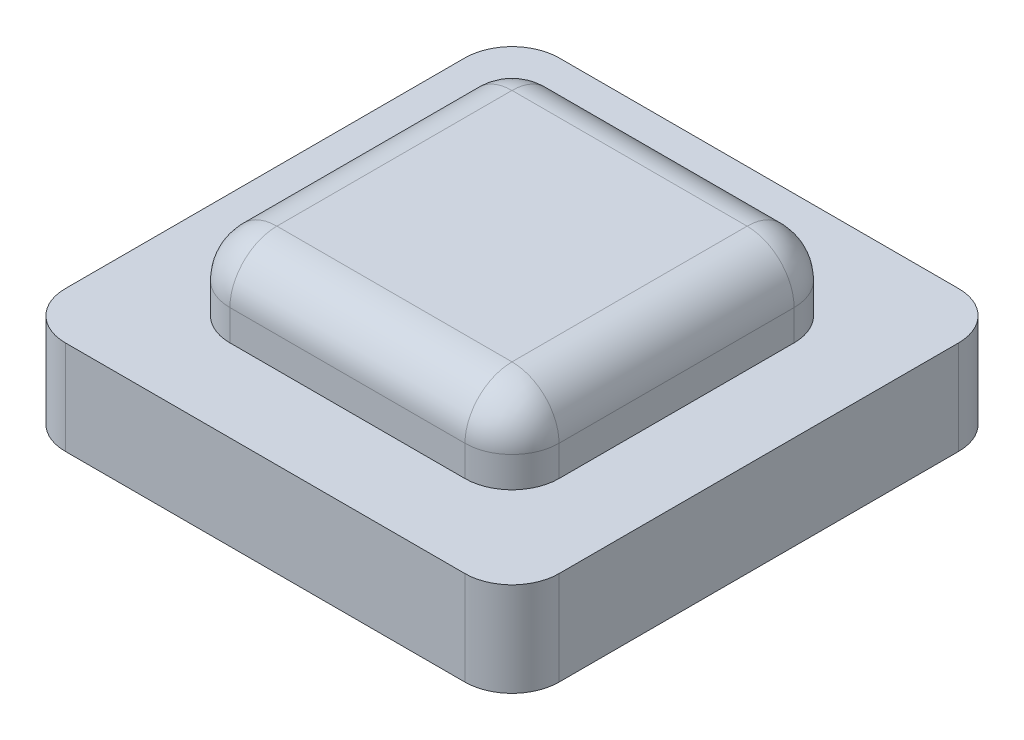
ISO-10303-21;
HEADER;
FILE_DESCRIPTION(('STEP AP214'),'2;1');
FILE_NAME('part.step','',(''),(''),'','','');
FILE_SCHEMA(('AUTOMOTIVE_DESIGN { 1 0 10303 214 1 1 1 1 }'));
ENDSEC;
DATA;
#1=APPLICATION_CONTEXT('core data for automotive mechanical design processes');
#2=APPLICATION_PROTOCOL_DEFINITION('international standard','automotive_design',2000,#1);
#3=PRODUCT_CONTEXT('',#1,'mechanical');
#4=PRODUCT('Part','Part','',(#3));
#5=PRODUCT_RELATED_PRODUCT_CATEGORY('part','',(#4));
#6=PRODUCT_DEFINITION_FORMATION('','',#4);
#7=PRODUCT_DEFINITION_CONTEXT('part definition',#1,'design');
#8=PRODUCT_DEFINITION('design','',#6,#7);
#9=PRODUCT_DEFINITION_SHAPE('','',#8);
#10=(LENGTH_UNIT() NAMED_UNIT(*) SI_UNIT(.MILLI.,.METRE.));
#11=(NAMED_UNIT(*) PLANE_ANGLE_UNIT() SI_UNIT($,.RADIAN.));
#12=(NAMED_UNIT(*) SI_UNIT($,.STERADIAN.) SOLID_ANGLE_UNIT());
#13=UNCERTAINTY_MEASURE_WITH_UNIT(LENGTH_MEASURE(1.E-05),#10,'distance_accuracy_value','');
#14=(GEOMETRIC_REPRESENTATION_CONTEXT(3) GLOBAL_UNCERTAINTY_ASSIGNED_CONTEXT((#13)) GLOBAL_UNIT_ASSIGNED_CONTEXT((#10,
#11,#12)) REPRESENTATION_CONTEXT('',''));
#15=CARTESIAN_POINT('',(0.,0.,0.));
#16=DIRECTION('',(0.,0.,1.));
#17=DIRECTION('',(1.,0.,0.));
#18=AXIS2_PLACEMENT_3D('',#15,#16,#17);
#19=CARTESIAN_POINT('',(0.,0.,0.));
#20=DIRECTION('',(0.,1.,0.));
#21=DIRECTION('',(0.,0.,1.));
#22=AXIS2_PLACEMENT_3D('',#19,#20,#21);
#23=PLANE('',#22);
#24=DIRECTION('',(0.,0.,1.));
#25=VECTOR('',#24,1.);
#26=CARTESIAN_POINT('',(-10.5,0.,-10.5));
#27=LINE('',#26,#25);
#28=CARTESIAN_POINT('',(-10.5,0.,-8.5));
#29=VERTEX_POINT('',#28);
#30=CARTESIAN_POINT('',(-10.5,0.,8.49999999999999));
#31=VERTEX_POINT('',#30);
#32=EDGE_CURVE('E240',#29,#31,#27,.T.);
#33=ORIENTED_EDGE('',*,*,#32,.F.);
#34=CARTESIAN_POINT('',(-8.5,0.,-8.5));
#35=DIRECTION('',(0.,1.,0.));
#36=DIRECTION('',(0.,0.,1.));
#37=AXIS2_PLACEMENT_3D('',#34,#35,#36);
#38=CIRCLE('',#37,2.);
#39=CARTESIAN_POINT('',(-8.5,0.,-10.5));
#40=VERTEX_POINT('',#39);
#41=EDGE_CURVE('E223',#29,#40,#38,.F.);
#42=ORIENTED_EDGE('',*,*,#41,.T.);
#43=DIRECTION('',(-1.,0.,0.));
#44=VECTOR('',#43,1.);
#45=CARTESIAN_POINT('',(-10.5,0.,-10.5));
#46=LINE('',#45,#44);
#47=CARTESIAN_POINT('',(8.49999999999999,0.,-10.5));
#48=VERTEX_POINT('',#47);
#49=EDGE_CURVE('E250',#48,#40,#46,.T.);
#50=ORIENTED_EDGE('',*,*,#49,.F.);
#51=CARTESIAN_POINT('',(8.5,0.,-8.5));
#52=DIRECTION('',(0.,1.,0.));
#53=DIRECTION('',(0.,0.,1.));
#54=AXIS2_PLACEMENT_3D('',#51,#52,#53);
#55=CIRCLE('',#54,2.);
#56=CARTESIAN_POINT('',(10.5,0.,-8.5));
#57=VERTEX_POINT('',#56);
#58=EDGE_CURVE('E234',#48,#57,#55,.F.);
#59=ORIENTED_EDGE('',*,*,#58,.T.);
#60=DIRECTION('',(0.,0.,-1.));
#61=VECTOR('',#60,1.);
#62=CARTESIAN_POINT('',(10.5,0.,-10.5));
#63=LINE('',#62,#61);
#64=CARTESIAN_POINT('',(10.5,0.,8.49999999999999));
#65=VERTEX_POINT('',#64);
#66=EDGE_CURVE('E255',#65,#57,#63,.T.);
#67=ORIENTED_EDGE('',*,*,#66,.F.);
#68=CARTESIAN_POINT('',(8.5,0.,8.5));
#69=DIRECTION('',(0.,1.,0.));
#70=DIRECTION('',(0.,0.,1.));
#71=AXIS2_PLACEMENT_3D('',#68,#69,#70);
#72=CIRCLE('',#71,2.);
#73=CARTESIAN_POINT('',(8.49999999999999,0.,10.5));
#74=VERTEX_POINT('',#73);
#75=EDGE_CURVE('E262',#65,#74,#72,.F.);
#76=ORIENTED_EDGE('',*,*,#75,.T.);
#77=DIRECTION('',(1.,0.,0.));
#78=VECTOR('',#77,1.);
#79=CARTESIAN_POINT('',(-10.5,0.,10.5));
#80=LINE('',#79,#78);
#81=CARTESIAN_POINT('',(-8.5,0.,10.5));
#82=VERTEX_POINT('',#81);
#83=EDGE_CURVE('E249',#82,#74,#80,.T.);
#84=ORIENTED_EDGE('',*,*,#83,.F.);
#85=CARTESIAN_POINT('',(-8.5,0.,8.5));
#86=DIRECTION('',(0.,1.,0.));
#87=DIRECTION('',(0.,0.,1.));
#88=AXIS2_PLACEMENT_3D('',#85,#86,#87);
#89=CIRCLE('',#88,2.);
#90=EDGE_CURVE('E244',#82,#31,#89,.F.);
#91=ORIENTED_EDGE('',*,*,#90,.T.);
#92=EDGE_LOOP('',(#33,#42,#50,#59,#67,#76,#84,#91));
#93=FACE_BOUND('',#92,.T.);
#94=DIRECTION('',(0.,0.,1.));
#95=VECTOR('',#94,1.);
#96=CARTESIAN_POINT('',(4.75,0.,4.75));
#97=LINE('',#96,#95);
#98=CARTESIAN_POINT('',(4.75,0.,-2.75));
#99=VERTEX_POINT('',#98);
#100=CARTESIAN_POINT('',(4.75,0.,2.75));
#101=VERTEX_POINT('',#100);
#102=EDGE_CURVE('E453',#99,#101,#97,.T.);
#103=ORIENTED_EDGE('',*,*,#102,.F.);
#104=CARTESIAN_POINT('',(2.75,0.,-2.75));
#105=DIRECTION('',(0.,1.,0.));
#106=DIRECTION('',(0.,0.,1.));
#107=AXIS2_PLACEMENT_3D('',#104,#105,#106);
#108=CIRCLE('',#107,2.);
#109=CARTESIAN_POINT('',(2.75,0.,-4.75));
#110=VERTEX_POINT('',#109);
#111=EDGE_CURVE('E11',#99,#110,#108,.T.);
#112=ORIENTED_EDGE('',*,*,#111,.T.);
#113=DIRECTION('',(1.,0.,0.));
#114=VECTOR('',#113,1.);
#115=CARTESIAN_POINT('',(-4.75,0.,-4.75));
#116=LINE('',#115,#114);
#117=CARTESIAN_POINT('',(-2.75,0.,-4.75));
#118=VERTEX_POINT('',#117);
#119=EDGE_CURVE('E456',#118,#110,#116,.T.);
#120=ORIENTED_EDGE('',*,*,#119,.F.);
#121=CARTESIAN_POINT('',(-2.75,0.,-2.75));
#122=DIRECTION('',(0.,1.,0.));
#123=DIRECTION('',(0.,0.,1.));
#124=AXIS2_PLACEMENT_3D('',#121,#122,#123);
#125=CIRCLE('',#124,2.);
#126=CARTESIAN_POINT('',(-4.75,0.,-2.75));
#127=VERTEX_POINT('',#126);
#128=EDGE_CURVE('E394',#118,#127,#125,.T.);
#129=ORIENTED_EDGE('',*,*,#128,.T.);
#130=DIRECTION('',(0.,0.,-1.));
#131=VECTOR('',#130,1.);
#132=CARTESIAN_POINT('',(-4.75,0.,4.75));
#133=LINE('',#132,#131);
#134=CARTESIAN_POINT('',(-4.75,0.,2.75));
#135=VERTEX_POINT('',#134);
#136=EDGE_CURVE('E452',#135,#127,#133,.T.);
#137=ORIENTED_EDGE('',*,*,#136,.F.);
#138=CARTESIAN_POINT('',(-2.75,0.,2.75));
#139=DIRECTION('',(0.,1.,0.));
#140=DIRECTION('',(0.,0.,1.));
#141=AXIS2_PLACEMENT_3D('',#138,#139,#140);
#142=CIRCLE('',#141,2.);
#143=CARTESIAN_POINT('',(-2.75,0.,4.75));
#144=VERTEX_POINT('',#143);
#145=EDGE_CURVE('E396',#135,#144,#142,.T.);
#146=ORIENTED_EDGE('',*,*,#145,.T.);
#147=DIRECTION('',(-1.,0.,0.));
#148=VECTOR('',#147,1.);
#149=CARTESIAN_POINT('',(-4.75,0.,4.75));
#150=LINE('',#149,#148);
#151=CARTESIAN_POINT('',(2.75,0.,4.75));
#152=VERTEX_POINT('',#151);
#153=EDGE_CURVE('E446',#152,#144,#150,.T.);
#154=ORIENTED_EDGE('',*,*,#153,.F.);
#155=CARTESIAN_POINT('',(2.75,0.,2.75));
#156=DIRECTION('',(0.,1.,0.));
#157=DIRECTION('',(0.,0.,1.));
#158=AXIS2_PLACEMENT_3D('',#155,#156,#157);
#159=CIRCLE('',#158,2.);
#160=EDGE_CURVE('E46',#152,#101,#159,.T.);
#161=ORIENTED_EDGE('',*,*,#160,.T.);
#162=EDGE_LOOP('',(#103,#112,#120,#129,#137,#146,#154,#161));
#163=FACE_BOUND('',#162,.T.);
#164=ADVANCED_FACE('F37',(#93,#163),#23,.F.);
#165=CARTESIAN_POINT('',(10.5,4.,-10.5));
#166=DIRECTION('',(-1.,0.,0.));
#167=DIRECTION('',(0.,0.,1.));
#168=AXIS2_PLACEMENT_3D('',#165,#166,#167);
#169=PLANE('',#168);
#170=ORIENTED_EDGE('',*,*,#66,.T.);
#171=DIRECTION('',(0.,-1.,0.));
#172=VECTOR('',#171,1.);
#173=CARTESIAN_POINT('',(10.5,4.,-8.5));
#174=LINE('',#173,#172);
#175=CARTESIAN_POINT('',(10.5,4.,-8.5));
#176=VERTEX_POINT('',#175);
#177=EDGE_CURVE('E279',#57,#176,#174,.F.);
#178=ORIENTED_EDGE('',*,*,#177,.T.);
#179=DIRECTION('',(0.,0.,-1.));
#180=VECTOR('',#179,1.);
#181=CARTESIAN_POINT('',(10.5,4.,-10.5));
#182=LINE('',#181,#180);
#183=CARTESIAN_POINT('',(10.5,4.,8.49999999999999));
#184=VERTEX_POINT('',#183);
#185=EDGE_CURVE('E253',#184,#176,#182,.T.);
#186=ORIENTED_EDGE('',*,*,#185,.F.);
#187=DIRECTION('',(0.,-1.,0.));
#188=VECTOR('',#187,1.);
#189=CARTESIAN_POINT('',(10.5,4.,8.5));
#190=LINE('',#189,#188);
#191=EDGE_CURVE('E276',#184,#65,#190,.T.);
#192=ORIENTED_EDGE('',*,*,#191,.T.);
#193=EDGE_LOOP('',(#170,#178,#186,#192));
#194=FACE_BOUND('',#193,.T.);
#195=ADVANCED_FACE('F475',(#194),#169,.F.);
#196=CARTESIAN_POINT('',(-10.5,4.,-10.5));
#197=DIRECTION('',(0.,0.,1.));
#198=DIRECTION('',(1.,0.,0.));
#199=AXIS2_PLACEMENT_3D('',#196,#197,#198);
#200=PLANE('',#199);
#201=ORIENTED_EDGE('',*,*,#49,.T.);
#202=DIRECTION('',(0.,-1.,0.));
#203=VECTOR('',#202,1.);
#204=CARTESIAN_POINT('',(-8.5,4.,-10.5));
#205=LINE('',#204,#203);
#206=CARTESIAN_POINT('',(-8.5,4.,-10.5));
#207=VERTEX_POINT('',#206);
#208=EDGE_CURVE('E228',#40,#207,#205,.F.);
#209=ORIENTED_EDGE('',*,*,#208,.T.);
#210=DIRECTION('',(-1.,0.,0.));
#211=VECTOR('',#210,1.);
#212=CARTESIAN_POINT('',(-10.5,4.,-10.5));
#213=LINE('',#212,#211);
#214=CARTESIAN_POINT('',(8.49999999999999,4.,-10.5));
#215=VERTEX_POINT('',#214);
#216=EDGE_CURVE('E466',#215,#207,#213,.T.);
#217=ORIENTED_EDGE('',*,*,#216,.F.);
#218=DIRECTION('',(0.,-1.,0.));
#219=VECTOR('',#218,1.);
#220=CARTESIAN_POINT('',(8.5,4.,-10.5));
#221=LINE('',#220,#219);
#222=EDGE_CURVE('E233',#215,#48,#221,.T.);
#223=ORIENTED_EDGE('',*,*,#222,.T.);
#224=EDGE_LOOP('',(#201,#209,#217,#223));
#225=FACE_BOUND('',#224,.T.);
#226=ADVANCED_FACE('F486',(#225),#200,.F.);
#227=CARTESIAN_POINT('',(-10.5,4.,-10.5));
#228=DIRECTION('',(1.,0.,0.));
#229=DIRECTION('',(0.,0.,-1.));
#230=AXIS2_PLACEMENT_3D('',#227,#228,#229);
#231=PLANE('',#230);
#232=DIRECTION('',(0.,0.,1.));
#233=VECTOR('',#232,1.);
#234=CARTESIAN_POINT('',(-10.5,4.,-10.5));
#235=LINE('',#234,#233);
#236=CARTESIAN_POINT('',(-10.5,4.,-8.5));
#237=VERTEX_POINT('',#236);
#238=CARTESIAN_POINT('',(-10.5,4.,8.49999999999999));
#239=VERTEX_POINT('',#238);
#240=EDGE_CURVE('E243',#237,#239,#235,.T.);
#241=ORIENTED_EDGE('',*,*,#240,.F.);
#242=DIRECTION('',(0.,-1.,0.));
#243=VECTOR('',#242,1.);
#244=CARTESIAN_POINT('',(-10.5,4.,-8.5));
#245=LINE('',#244,#243);
#246=EDGE_CURVE('E227',#237,#29,#245,.T.);
#247=ORIENTED_EDGE('',*,*,#246,.T.);
#248=ORIENTED_EDGE('',*,*,#32,.T.);
#249=DIRECTION('',(0.,-1.,0.));
#250=VECTOR('',#249,1.);
#251=CARTESIAN_POINT('',(-10.5,4.,8.5));
#252=LINE('',#251,#250);
#253=EDGE_CURVE('E245',#31,#239,#252,.F.);
#254=ORIENTED_EDGE('',*,*,#253,.T.);
#255=EDGE_LOOP('',(#241,#247,#248,#254));
#256=FACE_BOUND('',#255,.T.);
#257=ADVANCED_FACE('F239',(#256),#231,.F.);
#258=CARTESIAN_POINT('',(-10.5,4.,10.5));
#259=DIRECTION('',(0.,0.,-1.));
#260=DIRECTION('',(-1.,0.,0.));
#261=AXIS2_PLACEMENT_3D('',#258,#259,#260);
#262=PLANE('',#261);
#263=ORIENTED_EDGE('',*,*,#83,.T.);
#264=DIRECTION('',(0.,-1.,0.));
#265=VECTOR('',#264,1.);
#266=CARTESIAN_POINT('',(8.5,4.,10.5));
#267=LINE('',#266,#265);
#268=CARTESIAN_POINT('',(8.49999999999999,4.,10.5));
#269=VERTEX_POINT('',#268);
#270=EDGE_CURVE('E284',#74,#269,#267,.F.);
#271=ORIENTED_EDGE('',*,*,#270,.T.);
#272=DIRECTION('',(1.,0.,0.));
#273=VECTOR('',#272,1.);
#274=CARTESIAN_POINT('',(-10.5,4.,10.5));
#275=LINE('',#274,#273);
#276=CARTESIAN_POINT('',(-8.5,4.,10.5));
#277=VERTEX_POINT('',#276);
#278=EDGE_CURVE('E259',#277,#269,#275,.T.);
#279=ORIENTED_EDGE('',*,*,#278,.F.);
#280=DIRECTION('',(0.,-1.,0.));
#281=VECTOR('',#280,1.);
#282=CARTESIAN_POINT('',(-8.5,4.,10.5));
#283=LINE('',#282,#281);
#284=EDGE_CURVE('E281',#277,#82,#283,.T.);
#285=ORIENTED_EDGE('',*,*,#284,.T.);
#286=EDGE_LOOP('',(#263,#271,#279,#285));
#287=FACE_BOUND('',#286,.T.);
#288=ADVANCED_FACE('F493',(#287),#262,.F.);
#289=CARTESIAN_POINT('',(0.,4.,0.));
#290=DIRECTION('',(0.,1.,0.));
#291=DIRECTION('',(0.,0.,1.));
#292=AXIS2_PLACEMENT_3D('',#289,#290,#291);
#293=PLANE('',#292);
#294=DIRECTION('',(0.,0.,-1.));
#295=VECTOR('',#294,1.);
#296=CARTESIAN_POINT('',(7.,4.,-7.));
#297=LINE('',#296,#295);
#298=CARTESIAN_POINT('',(7.,4.,5.));
#299=VERTEX_POINT('',#298);
#300=CARTESIAN_POINT('',(7.,4.,-5.));
#301=VERTEX_POINT('',#300);
#302=EDGE_CURVE('E363',#299,#301,#297,.T.);
#303=ORIENTED_EDGE('',*,*,#302,.F.);
#304=CARTESIAN_POINT('',(5.,4.,5.));
#305=DIRECTION('',(0.,1.,0.));
#306=DIRECTION('',(0.,0.,1.));
#307=AXIS2_PLACEMENT_3D('',#304,#305,#306);
#308=CIRCLE('',#307,2.);
#309=CARTESIAN_POINT('',(5.,4.,7.));
#310=VERTEX_POINT('',#309);
#311=EDGE_CURVE('E326',#299,#310,#308,.F.);
#312=ORIENTED_EDGE('',*,*,#311,.T.);
#313=DIRECTION('',(1.,0.,0.));
#314=VECTOR('',#313,1.);
#315=CARTESIAN_POINT('',(-7.,4.,7.));
#316=LINE('',#315,#314);
#317=CARTESIAN_POINT('',(-5.,4.,7.));
#318=VERTEX_POINT('',#317);
#319=EDGE_CURVE('E458',#318,#310,#316,.T.);
#320=ORIENTED_EDGE('',*,*,#319,.F.);
#321=CARTESIAN_POINT('',(-5.,4.,5.));
#322=DIRECTION('',(0.,1.,0.));
#323=DIRECTION('',(0.,0.,1.));
#324=AXIS2_PLACEMENT_3D('',#321,#322,#323);
#325=CIRCLE('',#324,2.);
#326=CARTESIAN_POINT('',(-7.,4.,5.));
#327=VERTEX_POINT('',#326);
#328=EDGE_CURVE('E320',#318,#327,#325,.F.);
#329=ORIENTED_EDGE('',*,*,#328,.T.);
#330=DIRECTION('',(0.,0.,1.));
#331=VECTOR('',#330,1.);
#332=CARTESIAN_POINT('',(-7.,4.,-7.));
#333=LINE('',#332,#331);
#334=CARTESIAN_POINT('',(-7.,4.,-5.));
#335=VERTEX_POINT('',#334);
#336=EDGE_CURVE('E1037',#335,#327,#333,.T.);
#337=ORIENTED_EDGE('',*,*,#336,.F.);
#338=CARTESIAN_POINT('',(-5.,4.,-5.));
#339=DIRECTION('',(0.,1.,0.));
#340=DIRECTION('',(0.,0.,1.));
#341=AXIS2_PLACEMENT_3D('',#338,#339,#340);
#342=CIRCLE('',#341,2.);
#343=CARTESIAN_POINT('',(-5.,4.,-7.));
#344=VERTEX_POINT('',#343);
#345=EDGE_CURVE('E322',#335,#344,#342,.F.);
#346=ORIENTED_EDGE('',*,*,#345,.T.);
#347=DIRECTION('',(-1.,0.,0.));
#348=VECTOR('',#347,1.);
#349=CARTESIAN_POINT('',(-7.,4.,-7.));
#350=LINE('',#349,#348);
#351=CARTESIAN_POINT('',(5.,4.,-7.));
#352=VERTEX_POINT('',#351);
#353=EDGE_CURVE('E1021',#352,#344,#350,.T.);
#354=ORIENTED_EDGE('',*,*,#353,.F.);
#355=CARTESIAN_POINT('',(5.,4.,-5.));
#356=DIRECTION('',(0.,1.,0.));
#357=DIRECTION('',(0.,0.,1.));
#358=AXIS2_PLACEMENT_3D('',#355,#356,#357);
#359=CIRCLE('',#358,2.);
#360=EDGE_CURVE('E324',#352,#301,#359,.F.);
#361=ORIENTED_EDGE('',*,*,#360,.T.);
#362=EDGE_LOOP('',(#303,#312,#320,#329,#337,#346,#354,#361));
#363=FACE_BOUND('',#362,.T.);
#364=ORIENTED_EDGE('',*,*,#216,.T.);
#365=CARTESIAN_POINT('',(-8.5,4.,-8.5));
#366=DIRECTION('',(0.,1.,0.));
#367=DIRECTION('',(0.,0.,1.));
#368=AXIS2_PLACEMENT_3D('',#365,#366,#367);
#369=CIRCLE('',#368,2.);
#370=EDGE_CURVE('E274',#207,#237,#369,.T.);
#371=ORIENTED_EDGE('',*,*,#370,.T.);
#372=ORIENTED_EDGE('',*,*,#240,.T.);
#373=CARTESIAN_POINT('',(-8.5,4.,8.5));
#374=DIRECTION('',(0.,1.,0.));
#375=DIRECTION('',(0.,0.,1.));
#376=AXIS2_PLACEMENT_3D('',#373,#374,#375);
#377=CIRCLE('',#376,2.);
#378=EDGE_CURVE('E268',#239,#277,#377,.T.);
#379=ORIENTED_EDGE('',*,*,#378,.T.);
#380=ORIENTED_EDGE('',*,*,#278,.T.);
#381=CARTESIAN_POINT('',(8.5,4.,8.5));
#382=DIRECTION('',(0.,1.,0.));
#383=DIRECTION('',(0.,0.,1.));
#384=AXIS2_PLACEMENT_3D('',#381,#382,#383);
#385=CIRCLE('',#384,2.);
#386=EDGE_CURVE('E270',#269,#184,#385,.T.);
#387=ORIENTED_EDGE('',*,*,#386,.T.);
#388=ORIENTED_EDGE('',*,*,#185,.T.);
#389=CARTESIAN_POINT('',(8.5,4.,-8.5));
#390=DIRECTION('',(0.,1.,0.));
#391=DIRECTION('',(0.,0.,1.));
#392=AXIS2_PLACEMENT_3D('',#389,#390,#391);
#393=CIRCLE('',#392,2.);
#394=EDGE_CURVE('E272',#176,#215,#393,.T.);
#395=ORIENTED_EDGE('',*,*,#394,.T.);
#396=EDGE_LOOP('',(#364,#371,#372,#379,#380,#387,#388,#395));
#397=FACE_BOUND('',#396,.T.);
#398=ADVANCED_FACE('F484',(#363,#397),#293,.T.);
#399=CARTESIAN_POINT('',(4.75,-3.7,4.75));
#400=DIRECTION('',(-1.,0.,0.));
#401=DIRECTION('',(0.,0.,1.));
#402=AXIS2_PLACEMENT_3D('',#399,#400,#401);
#403=PLANE('',#402);
#404=ORIENTED_EDGE('',*,*,#102,.T.);
#405=DIRECTION('',(0.,1.,0.));
#406=VECTOR('',#405,1.);
#407=CARTESIAN_POINT('',(4.75,-3.7,2.75));
#408=LINE('',#407,#406);
#409=CARTESIAN_POINT('',(4.75,-1.7,2.75));
#410=VERTEX_POINT('',#409);
#411=EDGE_CURVE('E386',#101,#410,#408,.F.);
#412=ORIENTED_EDGE('',*,*,#411,.T.);
#413=DIRECTION('',(0.,0.,1.));
#414=VECTOR('',#413,1.);
#415=CARTESIAN_POINT('',(4.75,-1.7,-4.75));
#416=LINE('',#415,#414);
#417=CARTESIAN_POINT('',(4.75,-1.7,-2.75));
#418=VERTEX_POINT('',#417);
#419=EDGE_CURVE('E382',#410,#418,#416,.F.);
#420=ORIENTED_EDGE('',*,*,#419,.T.);
#421=DIRECTION('',(0.,1.,0.));
#422=VECTOR('',#421,1.);
#423=CARTESIAN_POINT('',(4.75,-3.7,-2.75));
#424=LINE('',#423,#422);
#425=EDGE_CURVE('E384',#418,#99,#424,.T.);
#426=ORIENTED_EDGE('',*,*,#425,.T.);
#427=EDGE_LOOP('',(#404,#412,#420,#426));
#428=FACE_BOUND('',#427,.T.);
#429=ADVANCED_FACE('F508',(#428),#403,.F.);
#430=CARTESIAN_POINT('',(-4.75,-3.7,4.75));
#431=DIRECTION('',(0.,0.,-1.));
#432=DIRECTION('',(-1.,0.,0.));
#433=AXIS2_PLACEMENT_3D('',#430,#431,#432);
#434=PLANE('',#433);
#435=ORIENTED_EDGE('',*,*,#153,.T.);
#436=DIRECTION('',(0.,1.,0.));
#437=VECTOR('',#436,1.);
#438=CARTESIAN_POINT('',(-2.75,-3.7,4.75));
#439=LINE('',#438,#437);
#440=CARTESIAN_POINT('',(-2.75,-1.7,4.75));
#441=VERTEX_POINT('',#440);
#442=EDGE_CURVE('E380',#144,#441,#439,.F.);
#443=ORIENTED_EDGE('',*,*,#442,.T.);
#444=DIRECTION('',(-1.,0.,0.));
#445=VECTOR('',#444,1.);
#446=CARTESIAN_POINT('',(4.75,-1.7,4.75));
#447=LINE('',#446,#445);
#448=CARTESIAN_POINT('',(2.75,-1.7,4.75));
#449=VERTEX_POINT('',#448);
#450=EDGE_CURVE('E376',#441,#449,#447,.F.);
#451=ORIENTED_EDGE('',*,*,#450,.T.);
#452=DIRECTION('',(0.,1.,0.));
#453=VECTOR('',#452,1.);
#454=CARTESIAN_POINT('',(2.75,-3.7,4.75));
#455=LINE('',#454,#453);
#456=EDGE_CURVE('E378',#449,#152,#455,.T.);
#457=ORIENTED_EDGE('',*,*,#456,.T.);
#458=EDGE_LOOP('',(#435,#443,#451,#457));
#459=FACE_BOUND('',#458,.T.);
#460=ADVANCED_FACE('F445',(#459),#434,.F.);
#461=CARTESIAN_POINT('',(-4.75,-3.7,4.75));
#462=DIRECTION('',(1.,0.,0.));
#463=DIRECTION('',(0.,0.,-1.));
#464=AXIS2_PLACEMENT_3D('',#461,#462,#463);
#465=PLANE('',#464);
#466=ORIENTED_EDGE('',*,*,#136,.T.);
#467=DIRECTION('',(0.,1.,0.));
#468=VECTOR('',#467,1.);
#469=CARTESIAN_POINT('',(-4.75,-3.7,-2.75));
#470=LINE('',#469,#468);
#471=CARTESIAN_POINT('',(-4.75,-1.7,-2.75));
#472=VERTEX_POINT('',#471);
#473=EDGE_CURVE('E374',#127,#472,#470,.F.);
#474=ORIENTED_EDGE('',*,*,#473,.T.);
#475=DIRECTION('',(0.,0.,-1.));
#476=VECTOR('',#475,1.);
#477=CARTESIAN_POINT('',(-4.75,-1.7,4.75));
#478=LINE('',#477,#476);
#479=CARTESIAN_POINT('',(-4.75,-1.7,2.75));
#480=VERTEX_POINT('',#479);
#481=EDGE_CURVE('E370',#472,#480,#478,.F.);
#482=ORIENTED_EDGE('',*,*,#481,.T.);
#483=DIRECTION('',(0.,1.,0.));
#484=VECTOR('',#483,1.);
#485=CARTESIAN_POINT('',(-4.75,-3.7,2.75));
#486=LINE('',#485,#484);
#487=EDGE_CURVE('E372',#480,#135,#486,.T.);
#488=ORIENTED_EDGE('',*,*,#487,.T.);
#489=EDGE_LOOP('',(#466,#474,#482,#488));
#490=FACE_BOUND('',#489,.T.);
#491=ADVANCED_FACE('F815',(#490),#465,.F.);
#492=CARTESIAN_POINT('',(-4.75,-3.7,-4.75));
#493=DIRECTION('',(0.,0.,1.));
#494=DIRECTION('',(1.,0.,0.));
#495=AXIS2_PLACEMENT_3D('',#492,#493,#494);
#496=PLANE('',#495);
#497=DIRECTION('',(1.,0.,0.));
#498=VECTOR('',#497,1.);
#499=CARTESIAN_POINT('',(-4.75,-1.7,-4.75));
#500=LINE('',#499,#498);
#501=CARTESIAN_POINT('',(2.75,-1.7,-4.75));
#502=VERTEX_POINT('',#501);
#503=CARTESIAN_POINT('',(-2.75,-1.7,-4.75));
#504=VERTEX_POINT('',#503);
#505=EDGE_CURVE('E328',#502,#504,#500,.F.);
#506=ORIENTED_EDGE('',*,*,#505,.T.);
#507=DIRECTION('',(0.,1.,0.));
#508=VECTOR('',#507,1.);
#509=CARTESIAN_POINT('',(-2.75,-3.7,-4.75));
#510=LINE('',#509,#508);
#511=EDGE_CURVE('E367',#504,#118,#510,.T.);
#512=ORIENTED_EDGE('',*,*,#511,.T.);
#513=ORIENTED_EDGE('',*,*,#119,.T.);
#514=DIRECTION('',(0.,1.,0.));
#515=VECTOR('',#514,1.);
#516=CARTESIAN_POINT('',(2.75,-3.7,-4.75));
#517=LINE('',#516,#515);
#518=EDGE_CURVE('E365',#110,#502,#517,.F.);
#519=ORIENTED_EDGE('',*,*,#518,.T.);
#520=EDGE_LOOP('',(#506,#512,#513,#519));
#521=FACE_BOUND('',#520,.T.);
#522=ADVANCED_FACE('F824',(#521),#496,.F.);
#523=CARTESIAN_POINT('',(0.,-3.7,0.));
#524=DIRECTION('',(0.,-1.,0.));
#525=DIRECTION('',(0.,0.,-1.));
#526=AXIS2_PLACEMENT_3D('',#523,#524,#525);
#527=PLANE('',#526);
#528=DIRECTION('',(0.,0.,-1.));
#529=VECTOR('',#528,1.);
#530=CARTESIAN_POINT('',(-2.75,-3.7,-4.75));
#531=LINE('',#530,#529);
#532=CARTESIAN_POINT('',(-2.75,-3.7,2.75));
#533=VERTEX_POINT('',#532);
#534=CARTESIAN_POINT('',(-2.75,-3.7,-2.75));
#535=VERTEX_POINT('',#534);
#536=EDGE_CURVE('E54',#533,#535,#531,.T.);
#537=ORIENTED_EDGE('',*,*,#536,.T.);
#538=DIRECTION('',(1.,0.,0.));
#539=VECTOR('',#538,1.);
#540=CARTESIAN_POINT('',(4.75,-3.7,-2.75));
#541=LINE('',#540,#539);
#542=CARTESIAN_POINT('',(2.75,-3.7,-2.75));
#543=VERTEX_POINT('',#542);
#544=EDGE_CURVE('E392',#535,#543,#541,.T.);
#545=ORIENTED_EDGE('',*,*,#544,.T.);
#546=DIRECTION('',(0.,0.,1.));
#547=VECTOR('',#546,1.);
#548=CARTESIAN_POINT('',(2.75,-3.7,4.75));
#549=LINE('',#548,#547);
#550=CARTESIAN_POINT('',(2.75,-3.7,2.75));
#551=VERTEX_POINT('',#550);
#552=EDGE_CURVE('E388',#543,#551,#549,.T.);
#553=ORIENTED_EDGE('',*,*,#552,.T.);
#554=DIRECTION('',(-1.,0.,0.));
#555=VECTOR('',#554,1.);
#556=CARTESIAN_POINT('',(-4.75,-3.7,2.75));
#557=LINE('',#556,#555);
#558=EDGE_CURVE('E59',#551,#533,#557,.T.);
#559=ORIENTED_EDGE('',*,*,#558,.T.);
#560=EDGE_LOOP('',(#537,#545,#553,#559));
#561=FACE_BOUND('',#560,.T.);
#562=ADVANCED_FACE('F726',(#561),#527,.T.);
#563=CARTESIAN_POINT('',(7.,7.3,-7.));
#564=DIRECTION('',(-1.,0.,0.));
#565=DIRECTION('',(0.,0.,1.));
#566=AXIS2_PLACEMENT_3D('',#563,#564,#565);
#567=PLANE('',#566);
#568=ORIENTED_EDGE('',*,*,#302,.T.);
#569=DIRECTION('',(0.,-1.,0.));
#570=VECTOR('',#569,1.);
#571=CARTESIAN_POINT('',(7.,7.3,-5.));
#572=LINE('',#571,#570);
#573=CARTESIAN_POINT('',(7.,5.3,-5.));
#574=VERTEX_POINT('',#573);
#575=EDGE_CURVE('E306',#301,#574,#572,.F.);
#576=ORIENTED_EDGE('',*,*,#575,.T.);
#577=DIRECTION('',(0.,0.,-1.));
#578=VECTOR('',#577,1.);
#579=CARTESIAN_POINT('',(7.,5.3,7.));
#580=LINE('',#579,#578);
#581=CARTESIAN_POINT('',(7.,5.3,5.));
#582=VERTEX_POINT('',#581);
#583=EDGE_CURVE('E304',#574,#582,#580,.F.);
#584=ORIENTED_EDGE('',*,*,#583,.T.);
#585=DIRECTION('',(0.,-1.,0.));
#586=VECTOR('',#585,1.);
#587=CARTESIAN_POINT('',(7.,7.3,5.));
#588=LINE('',#587,#586);
#589=EDGE_CURVE('E302',#582,#299,#588,.T.);
#590=ORIENTED_EDGE('',*,*,#589,.T.);
#591=EDGE_LOOP('',(#568,#576,#584,#590));
#592=FACE_BOUND('',#591,.T.);
#593=ADVANCED_FACE('F715',(#592),#567,.F.);
#594=CARTESIAN_POINT('',(-7.,7.3,-7.));
#595=DIRECTION('',(0.,0.,1.));
#596=DIRECTION('',(1.,0.,0.));
#597=AXIS2_PLACEMENT_3D('',#594,#595,#596);
#598=PLANE('',#597);
#599=ORIENTED_EDGE('',*,*,#353,.T.);
#600=DIRECTION('',(0.,-1.,0.));
#601=VECTOR('',#600,1.);
#602=CARTESIAN_POINT('',(-5.,7.3,-7.));
#603=LINE('',#602,#601);
#604=CARTESIAN_POINT('',(-5.,5.3,-7.));
#605=VERTEX_POINT('',#604);
#606=EDGE_CURVE('E312',#344,#605,#603,.F.);
#607=ORIENTED_EDGE('',*,*,#606,.T.);
#608=DIRECTION('',(-1.,0.,0.));
#609=VECTOR('',#608,1.);
#610=CARTESIAN_POINT('',(7.,5.3,-7.));
#611=LINE('',#610,#609);
#612=CARTESIAN_POINT('',(5.,5.3,-7.));
#613=VERTEX_POINT('',#612);
#614=EDGE_CURVE('E310',#605,#613,#611,.F.);
#615=ORIENTED_EDGE('',*,*,#614,.T.);
#616=DIRECTION('',(0.,-1.,0.));
#617=VECTOR('',#616,1.);
#618=CARTESIAN_POINT('',(5.,7.3,-7.));
#619=LINE('',#618,#617);
#620=EDGE_CURVE('E308',#613,#352,#619,.T.);
#621=ORIENTED_EDGE('',*,*,#620,.T.);
#622=EDGE_LOOP('',(#599,#607,#615,#621));
#623=FACE_BOUND('',#622,.T.);
#624=ADVANCED_FACE('F704',(#623),#598,.F.);
#625=CARTESIAN_POINT('',(-7.,7.3,-7.));
#626=DIRECTION('',(1.,0.,0.));
#627=DIRECTION('',(0.,0.,-1.));
#628=AXIS2_PLACEMENT_3D('',#625,#626,#627);
#629=PLANE('',#628);
#630=ORIENTED_EDGE('',*,*,#336,.T.);
#631=DIRECTION('',(0.,-1.,0.));
#632=VECTOR('',#631,1.);
#633=CARTESIAN_POINT('',(-7.,7.3,5.));
#634=LINE('',#633,#632);
#635=CARTESIAN_POINT('',(-7.,5.3,5.));
#636=VERTEX_POINT('',#635);
#637=EDGE_CURVE('E318',#327,#636,#634,.F.);
#638=ORIENTED_EDGE('',*,*,#637,.T.);
#639=DIRECTION('',(0.,0.,1.));
#640=VECTOR('',#639,1.);
#641=CARTESIAN_POINT('',(-7.,5.3,-7.));
#642=LINE('',#641,#640);
#643=CARTESIAN_POINT('',(-7.,5.3,-5.));
#644=VERTEX_POINT('',#643);
#645=EDGE_CURVE('E316',#636,#644,#642,.F.);
#646=ORIENTED_EDGE('',*,*,#645,.T.);
#647=DIRECTION('',(0.,-1.,0.));
#648=VECTOR('',#647,1.);
#649=CARTESIAN_POINT('',(-7.,7.3,-5.));
#650=LINE('',#649,#648);
#651=EDGE_CURVE('E314',#644,#335,#650,.T.);
#652=ORIENTED_EDGE('',*,*,#651,.T.);
#653=EDGE_LOOP('',(#630,#638,#646,#652));
#654=FACE_BOUND('',#653,.T.);
#655=ADVANCED_FACE('F693',(#654),#629,.F.);
#656=CARTESIAN_POINT('',(-7.,7.3,7.));
#657=DIRECTION('',(0.,0.,-1.));
#658=DIRECTION('',(-1.,0.,0.));
#659=AXIS2_PLACEMENT_3D('',#656,#657,#658);
#660=PLANE('',#659);
#661=DIRECTION('',(1.,0.,0.));
#662=VECTOR('',#661,1.);
#663=CARTESIAN_POINT('',(-7.,5.3,7.));
#664=LINE('',#663,#662);
#665=CARTESIAN_POINT('',(5.,5.3,7.));
#666=VERTEX_POINT('',#665);
#667=CARTESIAN_POINT('',(-5.,5.3,7.));
#668=VERTEX_POINT('',#667);
#669=EDGE_CURVE('E297',#666,#668,#664,.F.);
#670=ORIENTED_EDGE('',*,*,#669,.T.);
#671=DIRECTION('',(0.,-1.,0.));
#672=VECTOR('',#671,1.);
#673=CARTESIAN_POINT('',(-5.,7.3,7.));
#674=LINE('',#673,#672);
#675=EDGE_CURVE('E300',#668,#318,#674,.T.);
#676=ORIENTED_EDGE('',*,*,#675,.T.);
#677=ORIENTED_EDGE('',*,*,#319,.T.);
#678=DIRECTION('',(0.,-1.,0.));
#679=VECTOR('',#678,1.);
#680=CARTESIAN_POINT('',(5.,7.3,7.));
#681=LINE('',#680,#679);
#682=EDGE_CURVE('E295',#310,#666,#681,.F.);
#683=ORIENTED_EDGE('',*,*,#682,.T.);
#684=EDGE_LOOP('',(#670,#676,#677,#683));
#685=FACE_BOUND('',#684,.T.);
#686=ADVANCED_FACE('F680',(#685),#660,.F.);
#687=CARTESIAN_POINT('',(0.,7.3,0.));
#688=DIRECTION('',(0.,1.,0.));
#689=DIRECTION('',(0.,0.,1.));
#690=AXIS2_PLACEMENT_3D('',#687,#688,#689);
#691=PLANE('',#690);
#692=DIRECTION('',(0.,0.,1.));
#693=VECTOR('',#692,1.);
#694=CARTESIAN_POINT('',(-5.,7.3,7.));
#695=LINE('',#694,#693);
#696=CARTESIAN_POINT('',(-5.,7.3,-5.));
#697=VERTEX_POINT('',#696);
#698=CARTESIAN_POINT('',(-5.,7.3,5.));
#699=VERTEX_POINT('',#698);
#700=EDGE_CURVE('E286',#697,#699,#695,.T.);
#701=ORIENTED_EDGE('',*,*,#700,.T.);
#702=DIRECTION('',(1.,0.,0.));
#703=VECTOR('',#702,1.);
#704=CARTESIAN_POINT('',(7.,7.3,5.));
#705=LINE('',#704,#703);
#706=CARTESIAN_POINT('',(5.,7.3,5.));
#707=VERTEX_POINT('',#706);
#708=EDGE_CURVE('E292',#699,#707,#705,.T.);
#709=ORIENTED_EDGE('',*,*,#708,.T.);
#710=DIRECTION('',(0.,0.,-1.));
#711=VECTOR('',#710,1.);
#712=CARTESIAN_POINT('',(5.,7.3,-7.));
#713=LINE('',#712,#711);
#714=CARTESIAN_POINT('',(5.,7.3,-5.));
#715=VERTEX_POINT('',#714);
#716=EDGE_CURVE('E290',#707,#715,#713,.T.);
#717=ORIENTED_EDGE('',*,*,#716,.T.);
#718=DIRECTION('',(-1.,0.,0.));
#719=VECTOR('',#718,1.);
#720=CARTESIAN_POINT('',(-7.,7.3,-5.));
#721=LINE('',#720,#719);
#722=EDGE_CURVE('E288',#715,#697,#721,.T.);
#723=ORIENTED_EDGE('',*,*,#722,.T.);
#724=EDGE_LOOP('',(#701,#709,#717,#723));
#725=FACE_BOUND('',#724,.T.);
#726=ADVANCED_FACE('F675',(#725),#691,.T.);
#727=CARTESIAN_POINT('',(-8.5,4.,-8.5));
#728=DIRECTION('',(0.,-1.,0.));
#729=DIRECTION('',(0.,0.,-1.));
#730=AXIS2_PLACEMENT_3D('',#727,#728,#729);
#731=CYLINDRICAL_SURFACE('',#730,2.);
#732=ORIENTED_EDGE('',*,*,#370,.F.);
#733=ORIENTED_EDGE('',*,*,#208,.F.);
#734=ORIENTED_EDGE('',*,*,#41,.F.);
#735=ORIENTED_EDGE('',*,*,#246,.F.);
#736=EDGE_LOOP('',(#732,#733,#734,#735));
#737=FACE_BOUND('',#736,.T.);
#738=ADVANCED_FACE('F226',(#737),#731,.T.);
#739=CARTESIAN_POINT('',(8.5,4.,-8.5));
#740=DIRECTION('',(0.,-1.,0.));
#741=DIRECTION('',(0.,0.,-1.));
#742=AXIS2_PLACEMENT_3D('',#739,#740,#741);
#743=CYLINDRICAL_SURFACE('',#742,2.);
#744=ORIENTED_EDGE('',*,*,#394,.F.);
#745=ORIENTED_EDGE('',*,*,#177,.F.);
#746=ORIENTED_EDGE('',*,*,#58,.F.);
#747=ORIENTED_EDGE('',*,*,#222,.F.);
#748=EDGE_LOOP('',(#744,#745,#746,#747));
#749=FACE_BOUND('',#748,.T.);
#750=ADVANCED_FACE('F480',(#749),#743,.T.);
#751=CARTESIAN_POINT('',(8.5,4.,8.5));
#752=DIRECTION('',(0.,-1.,0.));
#753=DIRECTION('',(0.,0.,-1.));
#754=AXIS2_PLACEMENT_3D('',#751,#752,#753);
#755=CYLINDRICAL_SURFACE('',#754,2.);
#756=ORIENTED_EDGE('',*,*,#386,.F.);
#757=ORIENTED_EDGE('',*,*,#270,.F.);
#758=ORIENTED_EDGE('',*,*,#75,.F.);
#759=ORIENTED_EDGE('',*,*,#191,.F.);
#760=EDGE_LOOP('',(#756,#757,#758,#759));
#761=FACE_BOUND('',#760,.T.);
#762=ADVANCED_FACE('F515',(#761),#755,.T.);
#763=CARTESIAN_POINT('',(-8.5,4.,8.5));
#764=DIRECTION('',(0.,-1.,0.));
#765=DIRECTION('',(0.,0.,-1.));
#766=AXIS2_PLACEMENT_3D('',#763,#764,#765);
#767=CYLINDRICAL_SURFACE('',#766,2.);
#768=ORIENTED_EDGE('',*,*,#378,.F.);
#769=ORIENTED_EDGE('',*,*,#253,.F.);
#770=ORIENTED_EDGE('',*,*,#90,.F.);
#771=ORIENTED_EDGE('',*,*,#284,.F.);
#772=EDGE_LOOP('',(#768,#769,#770,#771));
#773=FACE_BOUND('',#772,.T.);
#774=ADVANCED_FACE('F518',(#773),#767,.T.);
#775=CARTESIAN_POINT('',(-5.,7.3,-5.));
#776=DIRECTION('',(0.,-1.,0.));
#777=DIRECTION('',(0.,0.,-1.));
#778=AXIS2_PLACEMENT_3D('',#775,#776,#777);
#779=CYLINDRICAL_SURFACE('',#778,2.);
#780=ORIENTED_EDGE('',*,*,#345,.F.);
#781=ORIENTED_EDGE('',*,*,#651,.F.);
#782=CARTESIAN_POINT('',(-5.,5.3,-5.));
#783=DIRECTION('',(0.,1.,0.));
#784=DIRECTION('',(0.,0.,1.));
#785=AXIS2_PLACEMENT_3D('',#782,#783,#784);
#786=CIRCLE('',#785,2.);
#787=EDGE_CURVE('E360',#605,#644,#786,.T.);
#788=ORIENTED_EDGE('',*,*,#787,.F.);
#789=ORIENTED_EDGE('',*,*,#606,.F.);
#790=EDGE_LOOP('',(#780,#781,#788,#789));
#791=FACE_BOUND('',#790,.T.);
#792=ADVANCED_FACE('F520',(#791),#779,.T.);
#793=CARTESIAN_POINT('',(0.,5.3,-5.));
#794=DIRECTION('',(1.,0.,0.));
#795=DIRECTION('',(0.,0.,-1.));
#796=AXIS2_PLACEMENT_3D('',#793,#794,#795);
#797=CYLINDRICAL_SURFACE('',#796,2.);
#798=CARTESIAN_POINT('',(5.,5.3,-5.));
#799=DIRECTION('',(1.,0.,0.));
#800=DIRECTION('',(0.,0.,-1.));
#801=AXIS2_PLACEMENT_3D('',#798,#799,#800);
#802=CIRCLE('',#801,2.);
#803=EDGE_CURVE('E354',#613,#715,#802,.T.);
#804=ORIENTED_EDGE('',*,*,#803,.F.);
#805=ORIENTED_EDGE('',*,*,#614,.F.);
#806=CARTESIAN_POINT('',(-5.,5.3,-5.));
#807=DIRECTION('',(-1.,0.,0.));
#808=DIRECTION('',(0.,0.,1.));
#809=AXIS2_PLACEMENT_3D('',#806,#807,#808);
#810=CIRCLE('',#809,2.);
#811=EDGE_CURVE('E357',#697,#605,#810,.T.);
#812=ORIENTED_EDGE('',*,*,#811,.F.);
#813=ORIENTED_EDGE('',*,*,#722,.F.);
#814=EDGE_LOOP('',(#804,#805,#812,#813));
#815=FACE_BOUND('',#814,.T.);
#816=ADVANCED_FACE('F526',(#815),#797,.T.);
#817=CARTESIAN_POINT('',(5.,7.3,-5.));
#818=DIRECTION('',(0.,-1.,0.));
#819=DIRECTION('',(0.,0.,-1.));
#820=AXIS2_PLACEMENT_3D('',#817,#818,#819);
#821=CYLINDRICAL_SURFACE('',#820,2.);
#822=ORIENTED_EDGE('',*,*,#360,.F.);
#823=ORIENTED_EDGE('',*,*,#620,.F.);
#824=CARTESIAN_POINT('',(5.,5.3,-5.));
#825=DIRECTION('',(0.,1.,0.));
#826=DIRECTION('',(0.,0.,1.));
#827=AXIS2_PLACEMENT_3D('',#824,#825,#826);
#828=CIRCLE('',#827,2.);
#829=EDGE_CURVE('E351',#574,#613,#828,.T.);
#830=ORIENTED_EDGE('',*,*,#829,.F.);
#831=ORIENTED_EDGE('',*,*,#575,.F.);
#832=EDGE_LOOP('',(#822,#823,#830,#831));
#833=FACE_BOUND('',#832,.T.);
#834=ADVANCED_FACE('F567',(#833),#821,.T.);
#835=CARTESIAN_POINT('',(-5.,5.3,-5.));
#836=DIRECTION('',(0.,0.,-1.));
#837=DIRECTION('',(-1.,0.,0.));
#838=AXIS2_PLACEMENT_3D('',#835,#836,#837);
#839=SPHERICAL_SURFACE('',#838,2.);
#840=ORIENTED_EDGE('',*,*,#811,.T.);
#841=ORIENTED_EDGE('',*,*,#787,.T.);
#842=CARTESIAN_POINT('',(-5.,5.3,-5.));
#843=DIRECTION('',(0.,0.,-1.));
#844=DIRECTION('',(-1.,0.,0.));
#845=AXIS2_PLACEMENT_3D('',#842,#843,#844);
#846=CIRCLE('',#845,2.);
#847=EDGE_CURVE('E348',#697,#644,#846,.F.);
#848=ORIENTED_EDGE('',*,*,#847,.F.);
#849=EDGE_LOOP('',(#840,#841,#848));
#850=FACE_BOUND('',#849,.T.);
#851=ADVANCED_FACE('F563',(#850),#839,.T.);
#852=CARTESIAN_POINT('',(5.,5.3,-5.));
#853=DIRECTION('',(0.,0.,-1.));
#854=DIRECTION('',(-1.,0.,0.));
#855=AXIS2_PLACEMENT_3D('',#852,#853,#854);
#856=SPHERICAL_SURFACE('',#855,2.);
#857=ORIENTED_EDGE('',*,*,#829,.T.);
#858=ORIENTED_EDGE('',*,*,#803,.T.);
#859=CARTESIAN_POINT('',(5.,5.3,-5.));
#860=DIRECTION('',(0.,0.,-1.));
#861=DIRECTION('',(-1.,0.,0.));
#862=AXIS2_PLACEMENT_3D('',#859,#860,#861);
#863=CIRCLE('',#862,2.);
#864=EDGE_CURVE('E345',#574,#715,#863,.F.);
#865=ORIENTED_EDGE('',*,*,#864,.F.);
#866=EDGE_LOOP('',(#857,#858,#865));
#867=FACE_BOUND('',#866,.T.);
#868=ADVANCED_FACE('F559',(#867),#856,.T.);
#869=CARTESIAN_POINT('',(-5.,7.3,5.));
#870=DIRECTION('',(0.,-1.,0.));
#871=DIRECTION('',(0.,0.,-1.));
#872=AXIS2_PLACEMENT_3D('',#869,#870,#871);
#873=CYLINDRICAL_SURFACE('',#872,2.);
#874=ORIENTED_EDGE('',*,*,#328,.F.);
#875=ORIENTED_EDGE('',*,*,#675,.F.);
#876=CARTESIAN_POINT('',(-5.,5.3,5.));
#877=DIRECTION('',(0.,1.,0.));
#878=DIRECTION('',(0.,0.,1.));
#879=AXIS2_PLACEMENT_3D('',#876,#877,#878);
#880=CIRCLE('',#879,2.);
#881=EDGE_CURVE('E342',#636,#668,#880,.T.);
#882=ORIENTED_EDGE('',*,*,#881,.F.);
#883=ORIENTED_EDGE('',*,*,#637,.F.);
#884=EDGE_LOOP('',(#874,#875,#882,#883));
#885=FACE_BOUND('',#884,.T.);
#886=ADVANCED_FACE('F555',(#885),#873,.T.);
#887=CARTESIAN_POINT('',(-5.,5.3,0.));
#888=DIRECTION('',(0.,0.,-1.));
#889=DIRECTION('',(-1.,0.,0.));
#890=AXIS2_PLACEMENT_3D('',#887,#888,#889);
#891=CYLINDRICAL_SURFACE('',#890,2.);
#892=ORIENTED_EDGE('',*,*,#847,.T.);
#893=ORIENTED_EDGE('',*,*,#645,.F.);
#894=CARTESIAN_POINT('',(-5.,5.3,5.));
#895=DIRECTION('',(0.,0.,1.));
#896=DIRECTION('',(1.,0.,0.));
#897=AXIS2_PLACEMENT_3D('',#894,#895,#896);
#898=CIRCLE('',#897,2.);
#899=EDGE_CURVE('E339',#699,#636,#898,.T.);
#900=ORIENTED_EDGE('',*,*,#899,.F.);
#901=ORIENTED_EDGE('',*,*,#700,.F.);
#902=EDGE_LOOP('',(#892,#893,#900,#901));
#903=FACE_BOUND('',#902,.T.);
#904=ADVANCED_FACE('F551',(#903),#891,.T.);
#905=CARTESIAN_POINT('',(5.,5.3,0.));
#906=DIRECTION('',(0.,0.,1.));
#907=DIRECTION('',(1.,0.,0.));
#908=AXIS2_PLACEMENT_3D('',#905,#906,#907);
#909=CYLINDRICAL_SURFACE('',#908,2.);
#910=ORIENTED_EDGE('',*,*,#864,.T.);
#911=ORIENTED_EDGE('',*,*,#716,.F.);
#912=CARTESIAN_POINT('',(5.,5.3,5.));
#913=DIRECTION('',(0.,0.,1.));
#914=DIRECTION('',(1.,0.,0.));
#915=AXIS2_PLACEMENT_3D('',#912,#913,#914);
#916=CIRCLE('',#915,2.);
#917=EDGE_CURVE('E336',#582,#707,#916,.T.);
#918=ORIENTED_EDGE('',*,*,#917,.F.);
#919=ORIENTED_EDGE('',*,*,#583,.F.);
#920=EDGE_LOOP('',(#910,#911,#918,#919));
#921=FACE_BOUND('',#920,.T.);
#922=ADVANCED_FACE('F547',(#921),#909,.T.);
#923=CARTESIAN_POINT('',(5.,7.3,5.));
#924=DIRECTION('',(0.,-1.,0.));
#925=DIRECTION('',(0.,0.,-1.));
#926=AXIS2_PLACEMENT_3D('',#923,#924,#925);
#927=CYLINDRICAL_SURFACE('',#926,2.);
#928=ORIENTED_EDGE('',*,*,#311,.F.);
#929=ORIENTED_EDGE('',*,*,#589,.F.);
#930=CARTESIAN_POINT('',(5.,5.3,5.));
#931=DIRECTION('',(0.,1.,0.));
#932=DIRECTION('',(0.,0.,1.));
#933=AXIS2_PLACEMENT_3D('',#930,#931,#932);
#934=CIRCLE('',#933,2.);
#935=EDGE_CURVE('E333',#666,#582,#934,.T.);
#936=ORIENTED_EDGE('',*,*,#935,.F.);
#937=ORIENTED_EDGE('',*,*,#682,.F.);
#938=EDGE_LOOP('',(#928,#929,#936,#937));
#939=FACE_BOUND('',#938,.T.);
#940=ADVANCED_FACE('F543',(#939),#927,.T.);
#941=CARTESIAN_POINT('',(-5.,5.3,5.));
#942=DIRECTION('',(-1.,0.,0.));
#943=DIRECTION('',(0.,0.,1.));
#944=AXIS2_PLACEMENT_3D('',#941,#942,#943);
#945=SPHERICAL_SURFACE('',#944,2.);
#946=ORIENTED_EDGE('',*,*,#899,.T.);
#947=ORIENTED_EDGE('',*,*,#881,.T.);
#948=CARTESIAN_POINT('',(-5.,5.3,5.));
#949=DIRECTION('',(-1.,0.,0.));
#950=DIRECTION('',(0.,0.,1.));
#951=AXIS2_PLACEMENT_3D('',#948,#949,#950);
#952=CIRCLE('',#951,2.);
#953=EDGE_CURVE('E331',#699,#668,#952,.F.);
#954=ORIENTED_EDGE('',*,*,#953,.F.);
#955=EDGE_LOOP('',(#946,#947,#954));
#956=FACE_BOUND('',#955,.T.);
#957=ADVANCED_FACE('F539',(#956),#945,.T.);
#958=CARTESIAN_POINT('',(5.,5.3,5.));
#959=DIRECTION('',(1.,0.,0.));
#960=DIRECTION('',(0.,0.,-1.));
#961=AXIS2_PLACEMENT_3D('',#958,#959,#960);
#962=SPHERICAL_SURFACE('',#961,2.);
#963=ORIENTED_EDGE('',*,*,#935,.T.);
#964=ORIENTED_EDGE('',*,*,#917,.T.);
#965=CARTESIAN_POINT('',(5.,5.3,5.));
#966=DIRECTION('',(1.,0.,0.));
#967=DIRECTION('',(0.,0.,-1.));
#968=AXIS2_PLACEMENT_3D('',#965,#966,#967);
#969=CIRCLE('',#968,2.);
#970=EDGE_CURVE('E329',#666,#707,#969,.F.);
#971=ORIENTED_EDGE('',*,*,#970,.F.);
#972=EDGE_LOOP('',(#963,#964,#971));
#973=FACE_BOUND('',#972,.T.);
#974=ADVANCED_FACE('F535',(#973),#962,.T.);
#975=CARTESIAN_POINT('',(0.,5.3,5.));
#976=DIRECTION('',(-1.,0.,0.));
#977=DIRECTION('',(0.,0.,1.));
#978=AXIS2_PLACEMENT_3D('',#975,#976,#977);
#979=CYLINDRICAL_SURFACE('',#978,2.);
#980=ORIENTED_EDGE('',*,*,#953,.T.);
#981=ORIENTED_EDGE('',*,*,#669,.F.);
#982=ORIENTED_EDGE('',*,*,#970,.T.);
#983=ORIENTED_EDGE('',*,*,#708,.F.);
#984=EDGE_LOOP('',(#980,#981,#982,#983));
#985=FACE_BOUND('',#984,.T.);
#986=ADVANCED_FACE('F532',(#985),#979,.T.);
#987=CARTESIAN_POINT('',(2.75,-3.7,2.75));
#988=DIRECTION('',(0.,1.,0.));
#989=DIRECTION('',(0.,0.,1.));
#990=AXIS2_PLACEMENT_3D('',#987,#988,#989);
#991=CYLINDRICAL_SURFACE('',#990,2.);
#992=CARTESIAN_POINT('',(2.75,-1.7,2.75));
#993=DIRECTION('',(0.,-1.,0.));
#994=DIRECTION('',(0.,0.,-1.));
#995=AXIS2_PLACEMENT_3D('',#992,#993,#994);
#996=CIRCLE('',#995,2.);
#997=EDGE_CURVE('E41',#410,#449,#996,.T.);
#998=ORIENTED_EDGE('',*,*,#997,.F.);
#999=ORIENTED_EDGE('',*,*,#411,.F.);
#1000=ORIENTED_EDGE('',*,*,#160,.F.);
#1001=ORIENTED_EDGE('',*,*,#456,.F.);
#1002=EDGE_LOOP('',(#998,#999,#1000,#1001));
#1003=FACE_BOUND('',#1002,.T.);
#1004=ADVANCED_FACE('F39',(#1003),#991,.T.);
#1005=CARTESIAN_POINT('',(2.75,-1.7,2.75));
#1006=DIRECTION('',(0.,0.,1.));
#1007=DIRECTION('',(1.,0.,0.));
#1008=AXIS2_PLACEMENT_3D('',#1005,#1006,#1007);
#1009=SPHERICAL_SURFACE('',#1008,2.);
#1010=CARTESIAN_POINT('',(2.75,-1.7,2.75));
#1011=DIRECTION('',(0.,0.,1.));
#1012=DIRECTION('',(1.,0.,0.));
#1013=AXIS2_PLACEMENT_3D('',#1010,#1011,#1012);
#1014=CIRCLE('',#1013,2.);
#1015=EDGE_CURVE('E425',#410,#551,#1014,.F.);
#1016=ORIENTED_EDGE('',*,*,#1015,.F.);
#1017=ORIENTED_EDGE('',*,*,#997,.T.);
#1018=CARTESIAN_POINT('',(2.75,-1.7,2.75));
#1019=DIRECTION('',(1.,0.,0.));
#1020=DIRECTION('',(0.,0.,-1.));
#1021=AXIS2_PLACEMENT_3D('',#1018,#1019,#1020);
#1022=CIRCLE('',#1021,2.);
#1023=EDGE_CURVE('E427',#551,#449,#1022,.F.);
#1024=ORIENTED_EDGE('',*,*,#1023,.F.);
#1025=EDGE_LOOP('',(#1016,#1017,#1024));
#1026=FACE_BOUND('',#1025,.T.);
#1027=ADVANCED_FACE('F436',(#1026),#1009,.T.);
#1028=CARTESIAN_POINT('',(-2.75,-3.7,2.75));
#1029=DIRECTION('',(0.,1.,0.));
#1030=DIRECTION('',(0.,0.,1.));
#1031=AXIS2_PLACEMENT_3D('',#1028,#1029,#1030);
#1032=CYLINDRICAL_SURFACE('',#1031,2.);
#1033=ORIENTED_EDGE('',*,*,#145,.F.);
#1034=ORIENTED_EDGE('',*,*,#487,.F.);
#1035=CARTESIAN_POINT('',(-2.75,-1.7,2.75));
#1036=DIRECTION('',(0.,-1.,0.));
#1037=DIRECTION('',(0.,0.,-1.));
#1038=AXIS2_PLACEMENT_3D('',#1035,#1036,#1037);
#1039=CIRCLE('',#1038,2.);
#1040=EDGE_CURVE('E422',#441,#480,#1039,.T.);
#1041=ORIENTED_EDGE('',*,*,#1040,.F.);
#1042=ORIENTED_EDGE('',*,*,#442,.F.);
#1043=EDGE_LOOP('',(#1033,#1034,#1041,#1042));
#1044=FACE_BOUND('',#1043,.T.);
#1045=ADVANCED_FACE('F610',(#1044),#1032,.T.);
#1046=CARTESIAN_POINT('',(0.,-1.7,2.75));
#1047=DIRECTION('',(1.,0.,0.));
#1048=DIRECTION('',(0.,0.,-1.));
#1049=AXIS2_PLACEMENT_3D('',#1046,#1047,#1048);
#1050=CYLINDRICAL_SURFACE('',#1049,2.);
#1051=ORIENTED_EDGE('',*,*,#1023,.T.);
#1052=ORIENTED_EDGE('',*,*,#450,.F.);
#1053=CARTESIAN_POINT('',(-2.75,-1.7,2.75));
#1054=DIRECTION('',(-1.,0.,0.));
#1055=DIRECTION('',(0.,0.,1.));
#1056=AXIS2_PLACEMENT_3D('',#1053,#1054,#1055);
#1057=CIRCLE('',#1056,2.);
#1058=EDGE_CURVE('E419',#533,#441,#1057,.T.);
#1059=ORIENTED_EDGE('',*,*,#1058,.F.);
#1060=ORIENTED_EDGE('',*,*,#558,.F.);
#1061=EDGE_LOOP('',(#1051,#1052,#1059,#1060));
#1062=FACE_BOUND('',#1061,.T.);
#1063=ADVANCED_FACE('F606',(#1062),#1050,.T.);
#1064=CARTESIAN_POINT('',(2.75,-1.7,0.));
#1065=DIRECTION('',(0.,0.,-1.));
#1066=DIRECTION('',(-1.,0.,0.));
#1067=AXIS2_PLACEMENT_3D('',#1064,#1065,#1066);
#1068=CYLINDRICAL_SURFACE('',#1067,2.);
#1069=ORIENTED_EDGE('',*,*,#1015,.T.);
#1070=ORIENTED_EDGE('',*,*,#552,.F.);
#1071=CARTESIAN_POINT('',(2.75,-1.7,-2.75));
#1072=DIRECTION('',(0.,0.,-1.));
#1073=DIRECTION('',(-1.,0.,0.));
#1074=AXIS2_PLACEMENT_3D('',#1071,#1072,#1073);
#1075=CIRCLE('',#1074,2.);
#1076=EDGE_CURVE('E416',#418,#543,#1075,.T.);
#1077=ORIENTED_EDGE('',*,*,#1076,.F.);
#1078=ORIENTED_EDGE('',*,*,#419,.F.);
#1079=EDGE_LOOP('',(#1069,#1070,#1077,#1078));
#1080=FACE_BOUND('',#1079,.T.);
#1081=ADVANCED_FACE('F602',(#1080),#1068,.T.);
#1082=CARTESIAN_POINT('',(2.75,-3.7,-2.75));
#1083=DIRECTION('',(0.,1.,0.));
#1084=DIRECTION('',(0.,0.,1.));
#1085=AXIS2_PLACEMENT_3D('',#1082,#1083,#1084);
#1086=CYLINDRICAL_SURFACE('',#1085,2.);
#1087=ORIENTED_EDGE('',*,*,#111,.F.);
#1088=ORIENTED_EDGE('',*,*,#425,.F.);
#1089=CARTESIAN_POINT('',(2.75,-1.7,-2.75));
#1090=DIRECTION('',(0.,-1.,0.));
#1091=DIRECTION('',(0.,0.,-1.));
#1092=AXIS2_PLACEMENT_3D('',#1089,#1090,#1091);
#1093=CIRCLE('',#1092,2.);
#1094=EDGE_CURVE('E413',#502,#418,#1093,.T.);
#1095=ORIENTED_EDGE('',*,*,#1094,.F.);
#1096=ORIENTED_EDGE('',*,*,#518,.F.);
#1097=EDGE_LOOP('',(#1087,#1088,#1095,#1096));
#1098=FACE_BOUND('',#1097,.T.);
#1099=ADVANCED_FACE('F598',(#1098),#1086,.T.);
#1100=CARTESIAN_POINT('',(-2.75,-1.7,2.75));
#1101=DIRECTION('',(0.,0.,1.));
#1102=DIRECTION('',(1.,0.,0.));
#1103=AXIS2_PLACEMENT_3D('',#1100,#1101,#1102);
#1104=SPHERICAL_SURFACE('',#1103,2.);
#1105=ORIENTED_EDGE('',*,*,#1058,.T.);
#1106=ORIENTED_EDGE('',*,*,#1040,.T.);
#1107=CARTESIAN_POINT('',(-2.75,-1.7,2.75));
#1108=DIRECTION('',(0.,0.,1.));
#1109=DIRECTION('',(1.,0.,0.));
#1110=AXIS2_PLACEMENT_3D('',#1107,#1108,#1109);
#1111=CIRCLE('',#1110,2.);
#1112=EDGE_CURVE('E410',#533,#480,#1111,.F.);
#1113=ORIENTED_EDGE('',*,*,#1112,.F.);
#1114=EDGE_LOOP('',(#1105,#1106,#1113));
#1115=FACE_BOUND('',#1114,.T.);
#1116=ADVANCED_FACE('F594',(#1115),#1104,.T.);
#1117=CARTESIAN_POINT('',(2.75,-1.7,-2.75));
#1118=DIRECTION('',(1.,0.,0.));
#1119=DIRECTION('',(0.,0.,-1.));
#1120=AXIS2_PLACEMENT_3D('',#1117,#1118,#1119);
#1121=SPHERICAL_SURFACE('',#1120,2.);
#1122=ORIENTED_EDGE('',*,*,#1094,.T.);
#1123=ORIENTED_EDGE('',*,*,#1076,.T.);
#1124=CARTESIAN_POINT('',(2.75,-1.7,-2.75));
#1125=DIRECTION('',(1.,0.,0.));
#1126=DIRECTION('',(0.,0.,-1.));
#1127=AXIS2_PLACEMENT_3D('',#1124,#1125,#1126);
#1128=CIRCLE('',#1127,2.);
#1129=EDGE_CURVE('E408',#502,#543,#1128,.F.);
#1130=ORIENTED_EDGE('',*,*,#1129,.F.);
#1131=EDGE_LOOP('',(#1122,#1123,#1130));
#1132=FACE_BOUND('',#1131,.T.);
#1133=ADVANCED_FACE('F590',(#1132),#1121,.T.);
#1134=CARTESIAN_POINT('',(-2.75,-1.7,0.));
#1135=DIRECTION('',(0.,0.,1.));
#1136=DIRECTION('',(1.,0.,0.));
#1137=AXIS2_PLACEMENT_3D('',#1134,#1135,#1136);
#1138=CYLINDRICAL_SURFACE('',#1137,2.);
#1139=ORIENTED_EDGE('',*,*,#1112,.T.);
#1140=ORIENTED_EDGE('',*,*,#481,.F.);
#1141=CARTESIAN_POINT('',(-2.75,-1.7,-2.75));
#1142=DIRECTION('',(0.,0.,-1.));
#1143=DIRECTION('',(-1.,0.,0.));
#1144=AXIS2_PLACEMENT_3D('',#1141,#1142,#1143);
#1145=CIRCLE('',#1144,2.);
#1146=EDGE_CURVE('E405',#535,#472,#1145,.T.);
#1147=ORIENTED_EDGE('',*,*,#1146,.F.);
#1148=ORIENTED_EDGE('',*,*,#536,.F.);
#1149=EDGE_LOOP('',(#1139,#1140,#1147,#1148));
#1150=FACE_BOUND('',#1149,.T.);
#1151=ADVANCED_FACE('F586',(#1150),#1138,.T.);
#1152=CARTESIAN_POINT('',(0.,-1.7,-2.75));
#1153=DIRECTION('',(-1.,0.,0.));
#1154=DIRECTION('',(0.,0.,1.));
#1155=AXIS2_PLACEMENT_3D('',#1152,#1153,#1154);
#1156=CYLINDRICAL_SURFACE('',#1155,2.);
#1157=ORIENTED_EDGE('',*,*,#1129,.T.);
#1158=ORIENTED_EDGE('',*,*,#544,.F.);
#1159=CARTESIAN_POINT('',(-2.75,-1.7,-2.75));
#1160=DIRECTION('',(-1.,0.,0.));
#1161=DIRECTION('',(0.,0.,1.));
#1162=AXIS2_PLACEMENT_3D('',#1159,#1160,#1161);
#1163=CIRCLE('',#1162,2.);
#1164=EDGE_CURVE('E402',#504,#535,#1163,.T.);
#1165=ORIENTED_EDGE('',*,*,#1164,.F.);
#1166=ORIENTED_EDGE('',*,*,#505,.F.);
#1167=EDGE_LOOP('',(#1157,#1158,#1165,#1166));
#1168=FACE_BOUND('',#1167,.T.);
#1169=ADVANCED_FACE('F582',(#1168),#1156,.T.);
#1170=CARTESIAN_POINT('',(-2.75,-1.7,-2.75));
#1171=DIRECTION('',(0.,-1.,0.));
#1172=DIRECTION('',(0.,0.,-1.));
#1173=AXIS2_PLACEMENT_3D('',#1170,#1171,#1172);
#1174=SPHERICAL_SURFACE('',#1173,2.);
#1175=ORIENTED_EDGE('',*,*,#1164,.T.);
#1176=ORIENTED_EDGE('',*,*,#1146,.T.);
#1177=CARTESIAN_POINT('',(-2.75,-1.7,-2.75));
#1178=DIRECTION('',(0.,-1.,0.));
#1179=DIRECTION('',(0.,0.,-1.));
#1180=AXIS2_PLACEMENT_3D('',#1177,#1178,#1179);
#1181=CIRCLE('',#1180,2.);
#1182=EDGE_CURVE('E399',#504,#472,#1181,.F.);
#1183=ORIENTED_EDGE('',*,*,#1182,.F.);
#1184=EDGE_LOOP('',(#1175,#1176,#1183));
#1185=FACE_BOUND('',#1184,.T.);
#1186=ADVANCED_FACE('F578',(#1185),#1174,.T.);
#1187=CARTESIAN_POINT('',(-2.75,-3.7,-2.75));
#1188=DIRECTION('',(0.,1.,0.));
#1189=DIRECTION('',(0.,0.,1.));
#1190=AXIS2_PLACEMENT_3D('',#1187,#1188,#1189);
#1191=CYLINDRICAL_SURFACE('',#1190,2.);
#1192=ORIENTED_EDGE('',*,*,#1182,.T.);
#1193=ORIENTED_EDGE('',*,*,#473,.F.);
#1194=ORIENTED_EDGE('',*,*,#128,.F.);
#1195=ORIENTED_EDGE('',*,*,#511,.F.);
#1196=EDGE_LOOP('',(#1192,#1193,#1194,#1195));
#1197=FACE_BOUND('',#1196,.T.);
#1198=ADVANCED_FACE('F575',(#1197),#1191,.T.);
#1199=CLOSED_SHELL('',(#164,#195,#226,#257,#288,#398,#429,#460,#491,#522,#562,#593,#624,#655,
#686,#726,#738,#750,#762,#774,#792,#816,#834,#851,#868,#886,#904,#922,#940,#957,#974,#986,#1004,
#1027,#1045,#1063,#1081,#1099,#1116,#1133,#1151,#1169,#1186,#1198));
#1200=MANIFOLD_SOLID_BREP('B2',#1199);
#1201=ADVANCED_BREP_SHAPE_REPRESENTATION('',(#18,#1200),#14);
#1202=SHAPE_DEFINITION_REPRESENTATION(#9,#1201);
ENDSEC;
END-ISO-10303-21;
